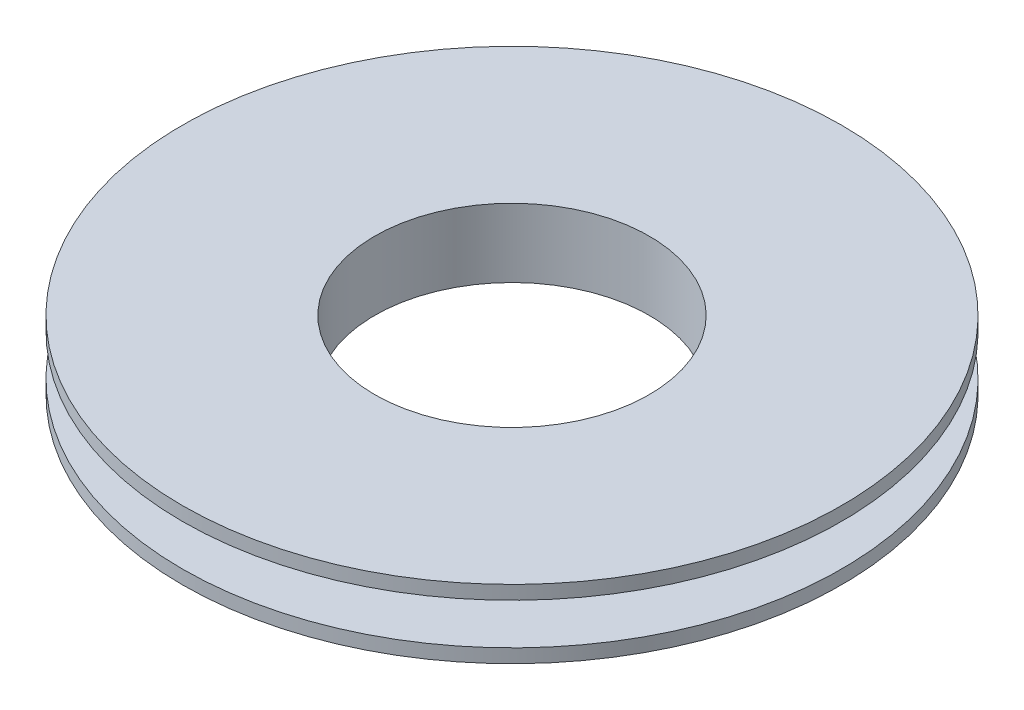
ISO-10303-21;
HEADER;
FILE_DESCRIPTION(('STEP AP214'),'2;1');
FILE_NAME('part.step','',(''),(''),'','','');
FILE_SCHEMA(('AUTOMOTIVE_DESIGN { 1 0 10303 214 1 1 1 1 }'));
ENDSEC;
DATA;
#1=APPLICATION_CONTEXT('core data for automotive mechanical design processes');
#2=APPLICATION_PROTOCOL_DEFINITION('international standard','automotive_design',2000,#1);
#3=PRODUCT_CONTEXT('',#1,'mechanical');
#4=PRODUCT('Part','Part','',(#3));
#5=PRODUCT_RELATED_PRODUCT_CATEGORY('part','',(#4));
#6=PRODUCT_DEFINITION_FORMATION('','',#4);
#7=PRODUCT_DEFINITION_CONTEXT('part definition',#1,'design');
#8=PRODUCT_DEFINITION('design','',#6,#7);
#9=PRODUCT_DEFINITION_SHAPE('','',#8);
#10=(LENGTH_UNIT() NAMED_UNIT(*) SI_UNIT(.MILLI.,.METRE.));
#11=(NAMED_UNIT(*) PLANE_ANGLE_UNIT() SI_UNIT($,.RADIAN.));
#12=(NAMED_UNIT(*) SI_UNIT($,.STERADIAN.) SOLID_ANGLE_UNIT());
#13=UNCERTAINTY_MEASURE_WITH_UNIT(LENGTH_MEASURE(1.E-05),#10,'distance_accuracy_value','');
#14=(GEOMETRIC_REPRESENTATION_CONTEXT(3) GLOBAL_UNCERTAINTY_ASSIGNED_CONTEXT((#13)) GLOBAL_UNIT_ASSIGNED_CONTEXT((#10,
#11,#12)) REPRESENTATION_CONTEXT('',''));
#15=CARTESIAN_POINT('',(0.,0.,0.));
#16=DIRECTION('',(0.,0.,1.));
#17=DIRECTION('',(1.,0.,0.));
#18=AXIS2_PLACEMENT_3D('',#15,#16,#17);
#19=CARTESIAN_POINT('',(0.,2.5,0.));
#20=DIRECTION('',(0.,-1.,0.));
#21=DIRECTION('',(0.,0.,-1.));
#22=AXIS2_PLACEMENT_3D('',#19,#20,#21);
#23=CYLINDRICAL_SURFACE('',#22,7.);
#24=CARTESIAN_POINT('',(0.,2.,0.));
#25=DIRECTION('',(0.,1.,0.));
#26=DIRECTION('',(0.,0.,1.));
#27=AXIS2_PLACEMENT_3D('',#24,#25,#26);
#28=CIRCLE('',#27,7.);
#29=CARTESIAN_POINT('',(0.,2.,7.));
#30=VERTEX_POINT('',#29);
#31=EDGE_CURVE('E50',#30,#30,#28,.T.);
#32=ORIENTED_EDGE('',*,*,#31,.F.);
#33=EDGE_LOOP('',(#32));
#34=FACE_BOUND('',#33,.T.);
#35=CARTESIAN_POINT('',(0.,0.5,0.));
#36=DIRECTION('',(0.,-1.,0.));
#37=DIRECTION('',(0.,0.,-1.));
#38=AXIS2_PLACEMENT_3D('',#35,#36,#37);
#39=CIRCLE('',#38,7.);
#40=CARTESIAN_POINT('',(0.,0.5,-7.));
#41=VERTEX_POINT('',#40);
#42=EDGE_CURVE('E10',#41,#41,#39,.T.);
#43=ORIENTED_EDGE('',*,*,#42,.F.);
#44=EDGE_LOOP('',(#43));
#45=FACE_BOUND('',#44,.T.);
#46=ADVANCED_FACE('F43',(#34,#45),#23,.T.);
#47=CARTESIAN_POINT('',(0.,2.5,0.));
#48=DIRECTION('',(0.,1.,0.));
#49=DIRECTION('',(0.,0.,1.));
#50=AXIS2_PLACEMENT_3D('',#47,#48,#49);
#51=PLANE('',#50);
#52=CARTESIAN_POINT('',(0.,2.5,0.));
#53=DIRECTION('',(0.,1.,0.));
#54=DIRECTION('',(0.,0.,1.));
#55=AXIS2_PLACEMENT_3D('',#52,#53,#54);
#56=CIRCLE('',#55,5.);
#57=CARTESIAN_POINT('',(0.,2.5,5.));
#58=VERTEX_POINT('',#57);
#59=EDGE_CURVE('E55',#58,#58,#56,.T.);
#60=ORIENTED_EDGE('',*,*,#59,.F.);
#61=EDGE_LOOP('',(#60));
#62=FACE_BOUND('',#61,.T.);
#63=CARTESIAN_POINT('',(0.,2.5,0.));
#64=DIRECTION('',(0.,1.,0.));
#65=DIRECTION('',(0.,0.,1.));
#66=AXIS2_PLACEMENT_3D('',#63,#64,#65);
#67=CIRCLE('',#66,12.);
#68=CARTESIAN_POINT('',(0.,2.5,12.));
#69=VERTEX_POINT('',#68);
#70=EDGE_CURVE('E67',#69,#69,#67,.T.);
#71=ORIENTED_EDGE('',*,*,#70,.T.);
#72=EDGE_LOOP('',(#71));
#73=FACE_BOUND('',#72,.T.);
#74=ADVANCED_FACE('F95',(#62,#73),#51,.T.);
#75=CARTESIAN_POINT('',(0.,0.,0.));
#76=DIRECTION('',(0.,1.,0.));
#77=DIRECTION('',(0.,0.,1.));
#78=AXIS2_PLACEMENT_3D('',#75,#76,#77);
#79=PLANE('',#78);
#80=CARTESIAN_POINT('',(0.,0.,0.));
#81=DIRECTION('',(0.,1.,0.));
#82=DIRECTION('',(0.,0.,1.));
#83=AXIS2_PLACEMENT_3D('',#80,#81,#82);
#84=CIRCLE('',#83,5.);
#85=CARTESIAN_POINT('',(0.,0.,5.));
#86=VERTEX_POINT('',#85);
#87=EDGE_CURVE('E60',#86,#86,#84,.T.);
#88=ORIENTED_EDGE('',*,*,#87,.T.);
#89=EDGE_LOOP('',(#88));
#90=FACE_BOUND('',#89,.T.);
#91=CARTESIAN_POINT('',(0.,0.,0.));
#92=DIRECTION('',(0.,-1.,0.));
#93=DIRECTION('',(0.,0.,-1.));
#94=AXIS2_PLACEMENT_3D('',#91,#92,#93);
#95=CIRCLE('',#94,12.);
#96=CARTESIAN_POINT('',(0.,0.,-12.));
#97=VERTEX_POINT('',#96);
#98=EDGE_CURVE('E75',#97,#97,#95,.T.);
#99=ORIENTED_EDGE('',*,*,#98,.T.);
#100=EDGE_LOOP('',(#99));
#101=FACE_BOUND('',#100,.T.);
#102=ADVANCED_FACE('F100',(#90,#101),#79,.F.);
#103=CARTESIAN_POINT('',(0.,2.5,0.));
#104=DIRECTION('',(0.,-1.,0.));
#105=DIRECTION('',(0.,0.,-1.));
#106=AXIS2_PLACEMENT_3D('',#103,#104,#105);
#107=CYLINDRICAL_SURFACE('',#106,5.);
#108=ORIENTED_EDGE('',*,*,#59,.T.);
#109=EDGE_LOOP('',(#108));
#110=FACE_BOUND('',#109,.T.);
#111=ORIENTED_EDGE('',*,*,#87,.F.);
#112=EDGE_LOOP('',(#111));
#113=FACE_BOUND('',#112,.T.);
#114=ADVANCED_FACE('F107',(#110,#113),#107,.F.);
#115=CARTESIAN_POINT('',(0.,2.,0.));
#116=DIRECTION('',(0.,1.,0.));
#117=DIRECTION('',(0.,0.,1.));
#118=AXIS2_PLACEMENT_3D('',#115,#116,#117);
#119=CYLINDRICAL_SURFACE('',#118,12.);
#120=CARTESIAN_POINT('',(0.,2.,0.));
#121=DIRECTION('',(0.,1.,0.));
#122=DIRECTION('',(0.,0.,1.));
#123=AXIS2_PLACEMENT_3D('',#120,#121,#122);
#124=CIRCLE('',#123,12.);
#125=CARTESIAN_POINT('',(0.,2.,12.));
#126=VERTEX_POINT('',#125);
#127=EDGE_CURVE('E65',#126,#126,#124,.T.);
#128=ORIENTED_EDGE('',*,*,#127,.T.);
#129=EDGE_LOOP('',(#128));
#130=FACE_BOUND('',#129,.T.);
#131=ORIENTED_EDGE('',*,*,#70,.F.);
#132=EDGE_LOOP('',(#131));
#133=FACE_BOUND('',#132,.T.);
#134=ADVANCED_FACE('F114',(#130,#133),#119,.T.);
#135=CARTESIAN_POINT('',(0.,2.,0.));
#136=DIRECTION('',(0.,1.,0.));
#137=DIRECTION('',(0.,0.,1.));
#138=AXIS2_PLACEMENT_3D('',#135,#136,#137);
#139=PLANE('',#138);
#140=ORIENTED_EDGE('',*,*,#31,.T.);
#141=EDGE_LOOP('',(#140));
#142=FACE_BOUND('',#141,.T.);
#143=ORIENTED_EDGE('',*,*,#127,.F.);
#144=EDGE_LOOP('',(#143));
#145=FACE_BOUND('',#144,.T.);
#146=ADVANCED_FACE('F92',(#142,#145),#139,.F.);
#147=CARTESIAN_POINT('',(0.,0.5,0.));
#148=DIRECTION('',(0.,-1.,0.));
#149=DIRECTION('',(0.,0.,-1.));
#150=AXIS2_PLACEMENT_3D('',#147,#148,#149);
#151=CYLINDRICAL_SURFACE('',#150,12.);
#152=CARTESIAN_POINT('',(0.,0.5,0.));
#153=DIRECTION('',(0.,-1.,0.));
#154=DIRECTION('',(0.,0.,-1.));
#155=AXIS2_PLACEMENT_3D('',#152,#153,#154);
#156=CIRCLE('',#155,12.);
#157=CARTESIAN_POINT('',(0.,0.5,-12.));
#158=VERTEX_POINT('',#157);
#159=EDGE_CURVE('E71',#158,#158,#156,.T.);
#160=ORIENTED_EDGE('',*,*,#159,.T.);
#161=EDGE_LOOP('',(#160));
#162=FACE_BOUND('',#161,.T.);
#163=ORIENTED_EDGE('',*,*,#98,.F.);
#164=EDGE_LOOP('',(#163));
#165=FACE_BOUND('',#164,.T.);
#166=ADVANCED_FACE('F83',(#162,#165),#151,.T.);
#167=CARTESIAN_POINT('',(0.,0.5,0.));
#168=DIRECTION('',(0.,-1.,0.));
#169=DIRECTION('',(0.,0.,-1.));
#170=AXIS2_PLACEMENT_3D('',#167,#168,#169);
#171=PLANE('',#170);
#172=ORIENTED_EDGE('',*,*,#42,.T.);
#173=EDGE_LOOP('',(#172));
#174=FACE_BOUND('',#173,.T.);
#175=ORIENTED_EDGE('',*,*,#159,.F.);
#176=EDGE_LOOP('',(#175));
#177=FACE_BOUND('',#176,.T.);
#178=ADVANCED_FACE('F86',(#174,#177),#171,.F.);
#179=CLOSED_SHELL('',(#46,#74,#102,#114,#134,#146,#166,#178));
#180=MANIFOLD_SOLID_BREP('B2',#179);
#181=ADVANCED_BREP_SHAPE_REPRESENTATION('',(#18,#180),#14);
#182=SHAPE_DEFINITION_REPRESENTATION(#9,#181);
ENDSEC;
END-ISO-10303-21;
